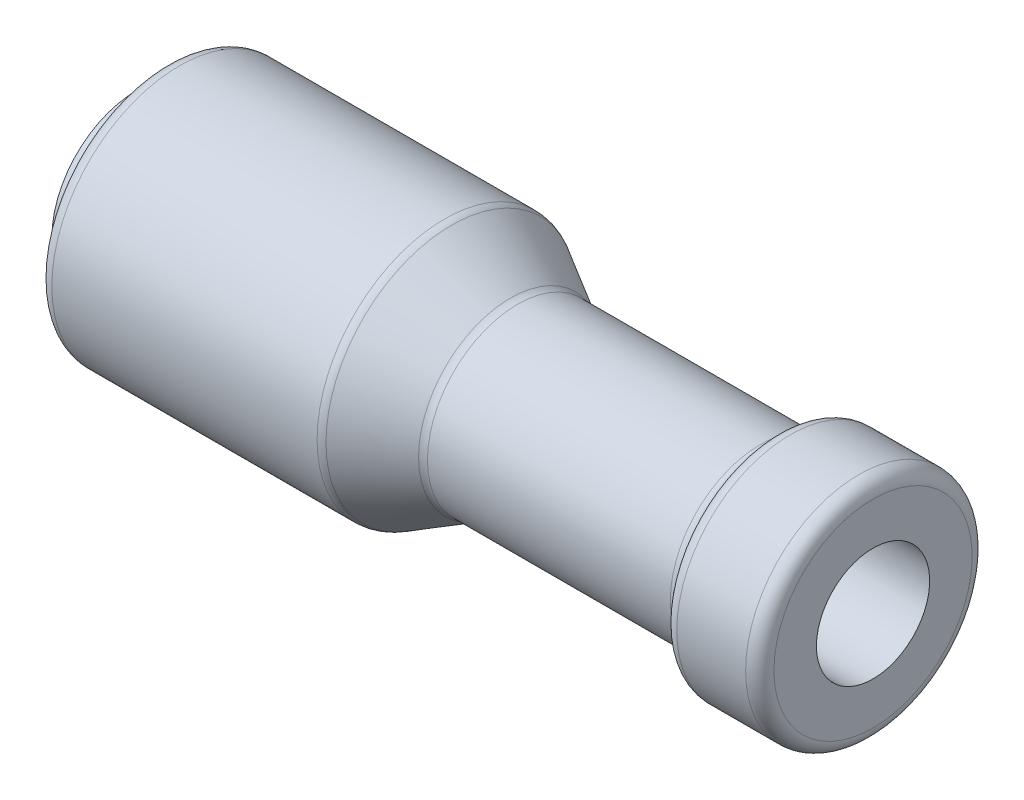
ISO-10303-21;
HEADER;
FILE_DESCRIPTION(('STEP AP214'),'2;1');
FILE_NAME('part.step','',(''),(''),'','','');
FILE_SCHEMA(('AUTOMOTIVE_DESIGN { 1 0 10303 214 1 1 1 1 }'));
ENDSEC;
DATA;
#1=APPLICATION_CONTEXT('core data for automotive mechanical design processes');
#2=APPLICATION_PROTOCOL_DEFINITION('international standard','automotive_design',2000,#1);
#3=PRODUCT_CONTEXT('',#1,'mechanical');
#4=PRODUCT('Part','Part','',(#3));
#5=PRODUCT_RELATED_PRODUCT_CATEGORY('part','',(#4));
#6=PRODUCT_DEFINITION_FORMATION('','',#4);
#7=PRODUCT_DEFINITION_CONTEXT('part definition',#1,'design');
#8=PRODUCT_DEFINITION('design','',#6,#7);
#9=PRODUCT_DEFINITION_SHAPE('','',#8);
#10=(LENGTH_UNIT() NAMED_UNIT(*) SI_UNIT(.MILLI.,.METRE.));
#11=(NAMED_UNIT(*) PLANE_ANGLE_UNIT() SI_UNIT($,.RADIAN.));
#12=(NAMED_UNIT(*) SI_UNIT($,.STERADIAN.) SOLID_ANGLE_UNIT());
#13=UNCERTAINTY_MEASURE_WITH_UNIT(LENGTH_MEASURE(1.E-05),#10,'distance_accuracy_value','');
#14=(GEOMETRIC_REPRESENTATION_CONTEXT(3) GLOBAL_UNCERTAINTY_ASSIGNED_CONTEXT((#13)) GLOBAL_UNIT_ASSIGNED_CONTEXT((#10,
#11,#12)) REPRESENTATION_CONTEXT('',''));
#15=CARTESIAN_POINT('',(0.,0.,0.));
#16=DIRECTION('',(0.,0.,1.));
#17=DIRECTION('',(1.,0.,0.));
#18=AXIS2_PLACEMENT_3D('',#15,#16,#17);
#19=CARTESIAN_POINT('',(-48.681122779021,0.,0.));
#20=DIRECTION('',(-1.,0.,0.));
#21=DIRECTION('',(0.,0.,1.));
#22=AXIS2_PLACEMENT_3D('',#19,#20,#21);
#23=CYLINDRICAL_SURFACE('',#22,3.);
#24=CARTESIAN_POINT('',(-20.3166176198955,0.,0.));
#25=DIRECTION('',(-1.,0.,0.));
#26=DIRECTION('',(0.,0.,1.));
#27=AXIS2_PLACEMENT_3D('',#24,#25,#26);
#28=CIRCLE('',#27,3.);
#29=CARTESIAN_POINT('',(-20.3166176198955,0.,3.));
#30=VERTEX_POINT('',#29);
#31=EDGE_CURVE('E74',#30,#30,#28,.T.);
#32=ORIENTED_EDGE('',*,*,#31,.F.);
#33=EDGE_LOOP('',(#32));
#34=FACE_BOUND('',#33,.T.);
#35=CARTESIAN_POINT('',(-19.3166176198955,0.,0.));
#36=DIRECTION('',(-1.,0.,0.));
#37=DIRECTION('',(0.,0.,1.));
#38=AXIS2_PLACEMENT_3D('',#35,#36,#37);
#39=CIRCLE('',#38,3.);
#40=CARTESIAN_POINT('',(-19.3166176198955,0.,3.));
#41=VERTEX_POINT('',#40);
#42=EDGE_CURVE('E83',#41,#41,#39,.T.);
#43=ORIENTED_EDGE('',*,*,#42,.T.);
#44=EDGE_LOOP('',(#43));
#45=FACE_BOUND('',#44,.T.);
#46=ADVANCED_FACE('F30',(#34,#45),#23,.T.);
#47=CARTESIAN_POINT('',(-20.3166176198955,0.,-2.));
#48=DIRECTION('',(1.,0.,0.));
#49=DIRECTION('',(0.,0.,-1.));
#50=AXIS2_PLACEMENT_3D('',#47,#48,#49);
#51=PLANE('',#50);
#52=CARTESIAN_POINT('',(-20.3166176198955,0.,0.));
#53=DIRECTION('',(-1.,0.,0.));
#54=DIRECTION('',(0.,0.,1.));
#55=AXIS2_PLACEMENT_3D('',#52,#53,#54);
#56=CIRCLE('',#55,2.);
#57=CARTESIAN_POINT('',(-20.3166176198955,0.,2.));
#58=VERTEX_POINT('',#57);
#59=EDGE_CURVE('E77',#58,#58,#56,.T.);
#60=ORIENTED_EDGE('',*,*,#59,.F.);
#61=EDGE_LOOP('',(#60));
#62=FACE_BOUND('',#61,.T.);
#63=ORIENTED_EDGE('',*,*,#31,.T.);
#64=EDGE_LOOP('',(#63));
#65=FACE_BOUND('',#64,.T.);
#66=ADVANCED_FACE('F103',(#62,#65),#51,.F.);
#67=CARTESIAN_POINT('',(-48.681122779021,0.,0.));
#68=DIRECTION('',(-1.,0.,0.));
#69=DIRECTION('',(0.,0.,1.));
#70=AXIS2_PLACEMENT_3D('',#67,#68,#69);
#71=CYLINDRICAL_SURFACE('',#70,2.);
#72=CARTESIAN_POINT('',(5.68338238010453,0.,0.));
#73=DIRECTION('',(-1.,0.,0.));
#74=DIRECTION('',(0.,0.,1.));
#75=AXIS2_PLACEMENT_3D('',#72,#73,#74);
#76=CIRCLE('',#75,2.);
#77=CARTESIAN_POINT('',(5.68338238010453,0.,2.));
#78=VERTEX_POINT('',#77);
#79=EDGE_CURVE('E80',#78,#78,#76,.T.);
#80=ORIENTED_EDGE('',*,*,#79,.F.);
#81=EDGE_LOOP('',(#80));
#82=FACE_BOUND('',#81,.T.);
#83=ORIENTED_EDGE('',*,*,#59,.T.);
#84=EDGE_LOOP('',(#83));
#85=FACE_BOUND('',#84,.T.);
#86=ADVANCED_FACE('F109',(#82,#85),#71,.F.);
#87=CARTESIAN_POINT('',(5.68338238010453,0.,-4.));
#88=DIRECTION('',(-1.,0.,0.));
#89=DIRECTION('',(0.,0.,1.));
#90=AXIS2_PLACEMENT_3D('',#87,#88,#89);
#91=PLANE('',#90);
#92=CARTESIAN_POINT('',(5.68338238010453,0.,0.));
#93=DIRECTION('',(-1.,0.,0.));
#94=DIRECTION('',(0.,0.,1.));
#95=AXIS2_PLACEMENT_3D('',#92,#93,#94);
#96=CIRCLE('',#95,3.5);
#97=CARTESIAN_POINT('',(5.68338238010453,0.,3.5));
#98=VERTEX_POINT('',#97);
#99=EDGE_CURVE('E65',#98,#98,#96,.F.);
#100=ORIENTED_EDGE('',*,*,#99,.T.);
#101=EDGE_LOOP('',(#100));
#102=FACE_BOUND('',#101,.T.);
#103=ORIENTED_EDGE('',*,*,#79,.T.);
#104=EDGE_LOOP('',(#103));
#105=FACE_BOUND('',#104,.T.);
#106=ADVANCED_FACE('F152',(#102,#105),#91,.F.);
#107=CARTESIAN_POINT('',(-48.681122779021,0.,0.));
#108=DIRECTION('',(-1.,0.,0.));
#109=DIRECTION('',(0.,0.,1.));
#110=AXIS2_PLACEMENT_3D('',#107,#108,#109);
#111=CYLINDRICAL_SURFACE('',#110,4.);
#112=CARTESIAN_POINT('',(5.18338238010453,0.,0.));
#113=DIRECTION('',(-1.,0.,0.));
#114=DIRECTION('',(0.,0.,1.));
#115=AXIS2_PLACEMENT_3D('',#112,#113,#114);
#116=CIRCLE('',#115,4.);
#117=CARTESIAN_POINT('',(5.18338238010453,0.,4.));
#118=VERTEX_POINT('',#117);
#119=EDGE_CURVE('E68',#118,#118,#116,.T.);
#120=ORIENTED_EDGE('',*,*,#119,.T.);
#121=EDGE_LOOP('',(#120));
#122=FACE_BOUND('',#121,.T.);
#123=CARTESIAN_POINT('',(2.75287888370825,0.,0.));
#124=DIRECTION('',(1.,0.,0.));
#125=DIRECTION('',(0.,0.,-1.));
#126=AXIS2_PLACEMENT_3D('',#123,#124,#125);
#127=CIRCLE('',#126,4.);
#128=CARTESIAN_POINT('',(2.75287888370825,0.,-4.));
#129=VERTEX_POINT('',#128);
#130=EDGE_CURVE('E71',#129,#129,#127,.T.);
#131=ORIENTED_EDGE('',*,*,#130,.T.);
#132=EDGE_LOOP('',(#131));
#133=FACE_BOUND('',#132,.T.);
#134=ADVANCED_FACE('F148',(#122,#133),#111,.T.);
#135=CARTESIAN_POINT('',(2.46258139732756,0.,0.));
#136=DIRECTION('',(1.,0.,0.));
#137=DIRECTION('',(0.,0.,-1.));
#138=AXIS2_PLACEMENT_3D('',#135,#136,#137);
#139=CONICAL_SURFACE('',#138,4.,1.05205776837881);
#140=CARTESIAN_POINT('',(2.31865624654448,0.,0.));
#141=DIRECTION('',(-1.,0.,0.));
#142=DIRECTION('',(0.,0.,1.));
#143=AXIS2_PLACEMENT_3D('',#140,#141,#142);
#144=CIRCLE('',#143,3.74789251980352);
#145=CARTESIAN_POINT('',(2.31865624654448,0.,3.74789251980352));
#146=VERTEX_POINT('',#145);
#147=EDGE_CURVE('E59',#146,#146,#144,.T.);
#148=ORIENTED_EDGE('',*,*,#147,.T.);
#149=EDGE_LOOP('',(#148));
#150=FACE_BOUND('',#149,.T.);
#151=CARTESIAN_POINT('',(2.13865272000399,0.,0.));
#152=DIRECTION('',(1.,0.,0.));
#153=DIRECTION('',(0.,0.,-1.));
#154=AXIS2_PLACEMENT_3D('',#151,#152,#153);
#155=CIRCLE('',#154,3.43258810458705);
#156=CARTESIAN_POINT('',(2.13865272000399,0.,-3.43258810458705));
#157=VERTEX_POINT('',#156);
#158=EDGE_CURVE('E62',#157,#157,#155,.T.);
#159=ORIENTED_EDGE('',*,*,#158,.T.);
#160=EDGE_LOOP('',(#159));
#161=FACE_BOUND('',#160,.T.);
#162=ADVANCED_FACE('F142',(#150,#161),#139,.T.);
#163=CARTESIAN_POINT('',(-48.681122779021,0.,0.));
#164=DIRECTION('',(-1.,0.,0.));
#165=DIRECTION('',(0.,0.,1.));
#166=AXIS2_PLACEMENT_3D('',#163,#164,#165);
#167=CYLINDRICAL_SURFACE('',#166,3.18048062439057);
#168=CARTESIAN_POINT('',(1.70443008284022,0.,0.));
#169=DIRECTION('',(-1.,0.,0.));
#170=DIRECTION('',(0.,0.,1.));
#171=AXIS2_PLACEMENT_3D('',#168,#169,#170);
#172=CIRCLE('',#171,3.18048062439057);
#173=CARTESIAN_POINT('',(1.70443008284022,0.,3.18048062439057));
#174=VERTEX_POINT('',#173);
#175=EDGE_CURVE('E53',#174,#174,#172,.T.);
#176=ORIENTED_EDGE('',*,*,#175,.T.);
#177=EDGE_LOOP('',(#176));
#178=FACE_BOUND('',#177,.T.);
#179=CARTESIAN_POINT('',(-6.87259928096326,0.,0.));
#180=DIRECTION('',(-1.,0.,0.));
#181=DIRECTION('',(0.,0.,1.));
#182=AXIS2_PLACEMENT_3D('',#179,#180,#181);
#183=CIRCLE('',#182,3.18048062439057);
#184=CARTESIAN_POINT('',(-6.87259928096326,0.,3.18048062439057));
#185=VERTEX_POINT('',#184);
#186=EDGE_CURVE('E56',#185,#185,#183,.F.);
#187=ORIENTED_EDGE('',*,*,#186,.T.);
#188=EDGE_LOOP('',(#187));
#189=FACE_BOUND('',#188,.T.);
#190=ADVANCED_FACE('F136',(#178,#189),#167,.T.);
#191=CARTESIAN_POINT('',(-7.00527243077909,0.,0.));
#192=DIRECTION('',(-1.,0.,0.));
#193=DIRECTION('',(0.,0.,1.));
#194=AXIS2_PLACEMENT_3D('',#191,#192,#193);
#195=CONICAL_SURFACE('',#194,3.18048062439057,0.518738558416091);
#196=CARTESIAN_POINT('',(-7.12049180076679,0.,0.));
#197=DIRECTION('',(-1.,0.,0.));
#198=DIRECTION('',(0.,0.,1.));
#199=AXIS2_PLACEMENT_3D('',#196,#197,#198);
#200=CIRCLE('',#199,3.2462579872268);
#201=CARTESIAN_POINT('',(-7.12049180076679,0.,3.2462579872268));
#202=VERTEX_POINT('',#201);
#203=EDGE_CURVE('E45',#202,#202,#200,.T.);
#204=ORIENTED_EDGE('',*,*,#203,.T.);
#205=EDGE_LOOP('',(#204));
#206=FACE_BOUND('',#205,.T.);
#207=CARTESIAN_POINT('',(-9.20139824990777,0.,0.));
#208=DIRECTION('',(1.,0.,0.));
#209=DIRECTION('',(0.,0.,-1.));
#210=AXIS2_PLACEMENT_3D('',#207,#208,#209);
#211=CIRCLE('',#210,4.43422263716377);
#212=CARTESIAN_POINT('',(-9.20139824990777,0.,-4.43422263716377));
#213=VERTEX_POINT('',#212);
#214=EDGE_CURVE('E50',#213,#213,#211,.T.);
#215=ORIENTED_EDGE('',*,*,#214,.T.);
#216=EDGE_LOOP('',(#215));
#217=FACE_BOUND('',#216,.T.);
#218=ADVANCED_FACE('F100',(#206,#217),#195,.T.);
#219=CARTESIAN_POINT('',(-48.681122779021,0.,0.));
#220=DIRECTION('',(-1.,0.,0.));
#221=DIRECTION('',(0.,0.,1.));
#222=AXIS2_PLACEMENT_3D('',#219,#220,#221);
#223=CYLINDRICAL_SURFACE('',#222,4.5);
#224=CARTESIAN_POINT('',(-9.44929076971129,0.,0.));
#225=DIRECTION('',(1.,0.,0.));
#226=DIRECTION('',(0.,0.,-1.));
#227=AXIS2_PLACEMENT_3D('',#224,#225,#226);
#228=CIRCLE('',#227,4.5);
#229=CARTESIAN_POINT('',(-9.44929076971129,0.,-4.5));
#230=VERTEX_POINT('',#229);
#231=EDGE_CURVE('E37',#230,#230,#228,.F.);
#232=ORIENTED_EDGE('',*,*,#231,.T.);
#233=EDGE_LOOP('',(#232));
#234=FACE_BOUND('',#233,.T.);
#235=CARTESIAN_POINT('',(-18.8166176198955,0.,0.));
#236=DIRECTION('',(1.,0.,0.));
#237=DIRECTION('',(0.,0.,-1.));
#238=AXIS2_PLACEMENT_3D('',#235,#236,#237);
#239=CIRCLE('',#238,4.5);
#240=CARTESIAN_POINT('',(-18.8166176198955,0.,-4.5));
#241=VERTEX_POINT('',#240);
#242=EDGE_CURVE('E41',#241,#241,#239,.T.);
#243=ORIENTED_EDGE('',*,*,#242,.T.);
#244=EDGE_LOOP('',(#243));
#245=FACE_BOUND('',#244,.T.);
#246=ADVANCED_FACE('F91',(#234,#245),#223,.T.);
#247=CARTESIAN_POINT('',(-19.3166176198955,0.,-3.));
#248=DIRECTION('',(1.,0.,0.));
#249=DIRECTION('',(0.,0.,-1.));
#250=AXIS2_PLACEMENT_3D('',#247,#248,#249);
#251=PLANE('',#250);
#252=CARTESIAN_POINT('',(-19.3166176198955,0.,0.));
#253=DIRECTION('',(1.,0.,0.));
#254=DIRECTION('',(0.,0.,-1.));
#255=AXIS2_PLACEMENT_3D('',#252,#253,#254);
#256=CIRCLE('',#255,4.);
#257=CARTESIAN_POINT('',(-19.3166176198955,0.,-4.));
#258=VERTEX_POINT('',#257);
#259=EDGE_CURVE('E10',#258,#258,#256,.F.);
#260=ORIENTED_EDGE('',*,*,#259,.T.);
#261=EDGE_LOOP('',(#260));
#262=FACE_BOUND('',#261,.T.);
#263=ORIENTED_EDGE('',*,*,#42,.F.);
#264=EDGE_LOOP('',(#263));
#265=FACE_BOUND('',#264,.T.);
#266=ADVANCED_FACE('F88',(#262,#265),#251,.F.);
#267=CARTESIAN_POINT('',(5.18338238010453,0.,0.));
#268=DIRECTION('',(-1.,0.,0.));
#269=DIRECTION('',(0.,0.,1.));
#270=AXIS2_PLACEMENT_3D('',#267,#268,#269);
#271=TOROIDAL_SURFACE('',#270,3.5,0.5);
#272=ORIENTED_EDGE('',*,*,#99,.F.);
#273=EDGE_LOOP('',(#272));
#274=FACE_BOUND('',#273,.T.);
#275=ORIENTED_EDGE('',*,*,#119,.F.);
#276=EDGE_LOOP('',(#275));
#277=FACE_BOUND('',#276,.T.);
#278=ADVANCED_FACE('F90',(#274,#277),#271,.T.);
#279=CARTESIAN_POINT('',(2.75287888370825,0.,0.));
#280=DIRECTION('',(1.,0.,0.));
#281=DIRECTION('',(0.,0.,-1.));
#282=AXIS2_PLACEMENT_3D('',#279,#280,#281);
#283=TOROIDAL_SURFACE('',#282,3.5,0.5);
#284=ORIENTED_EDGE('',*,*,#130,.F.);
#285=EDGE_LOOP('',(#284));
#286=FACE_BOUND('',#285,.T.);
#287=ORIENTED_EDGE('',*,*,#147,.F.);
#288=EDGE_LOOP('',(#287));
#289=FACE_BOUND('',#288,.T.);
#290=ADVANCED_FACE('F97',(#286,#289),#283,.T.);
#291=CARTESIAN_POINT('',(1.70443008284022,0.,0.));
#292=DIRECTION('',(-1.,0.,0.));
#293=DIRECTION('',(0.,0.,1.));
#294=AXIS2_PLACEMENT_3D('',#291,#292,#293);
#295=TOROIDAL_SURFACE('',#294,3.68048062439057,0.5);
#296=ORIENTED_EDGE('',*,*,#158,.F.);
#297=EDGE_LOOP('',(#296));
#298=FACE_BOUND('',#297,.T.);
#299=ORIENTED_EDGE('',*,*,#175,.F.);
#300=EDGE_LOOP('',(#299));
#301=FACE_BOUND('',#300,.T.);
#302=ADVANCED_FACE('F117',(#298,#301),#295,.F.);
#303=CARTESIAN_POINT('',(-6.87259928096326,0.,0.));
#304=DIRECTION('',(-1.,0.,0.));
#305=DIRECTION('',(0.,0.,1.));
#306=AXIS2_PLACEMENT_3D('',#303,#304,#305);
#307=TOROIDAL_SURFACE('',#306,3.68048062439057,0.5);
#308=ORIENTED_EDGE('',*,*,#186,.F.);
#309=EDGE_LOOP('',(#308));
#310=FACE_BOUND('',#309,.T.);
#311=ORIENTED_EDGE('',*,*,#203,.F.);
#312=EDGE_LOOP('',(#311));
#313=FACE_BOUND('',#312,.T.);
#314=ADVANCED_FACE('F121',(#310,#313),#307,.F.);
#315=CARTESIAN_POINT('',(-9.44929076971129,0.,0.));
#316=DIRECTION('',(1.,0.,0.));
#317=DIRECTION('',(0.,0.,-1.));
#318=AXIS2_PLACEMENT_3D('',#315,#316,#317);
#319=TOROIDAL_SURFACE('',#318,4.,0.5);
#320=ORIENTED_EDGE('',*,*,#214,.F.);
#321=EDGE_LOOP('',(#320));
#322=FACE_BOUND('',#321,.T.);
#323=ORIENTED_EDGE('',*,*,#231,.F.);
#324=EDGE_LOOP('',(#323));
#325=FACE_BOUND('',#324,.T.);
#326=ADVANCED_FACE('F124',(#322,#325),#319,.T.);
#327=CARTESIAN_POINT('',(-18.8166176198955,0.,0.));
#328=DIRECTION('',(1.,0.,0.));
#329=DIRECTION('',(0.,0.,-1.));
#330=AXIS2_PLACEMENT_3D('',#327,#328,#329);
#331=TOROIDAL_SURFACE('',#330,4.,0.5);
#332=ORIENTED_EDGE('',*,*,#242,.F.);
#333=EDGE_LOOP('',(#332));
#334=FACE_BOUND('',#333,.T.);
#335=ORIENTED_EDGE('',*,*,#259,.F.);
#336=EDGE_LOOP('',(#335));
#337=FACE_BOUND('',#336,.T.);
#338=ADVANCED_FACE('F32',(#334,#337),#331,.T.);
#339=CLOSED_SHELL('',(#46,#66,#86,#106,#134,#162,#190,#218,#246,#266,#278,#290,#302,#314,#326,#338));
#340=MANIFOLD_SOLID_BREP('B2',#339);
#341=ADVANCED_BREP_SHAPE_REPRESENTATION('',(#18,#340),#14);
#342=SHAPE_DEFINITION_REPRESENTATION(#9,#341);
ENDSEC;
END-ISO-10303-21;
